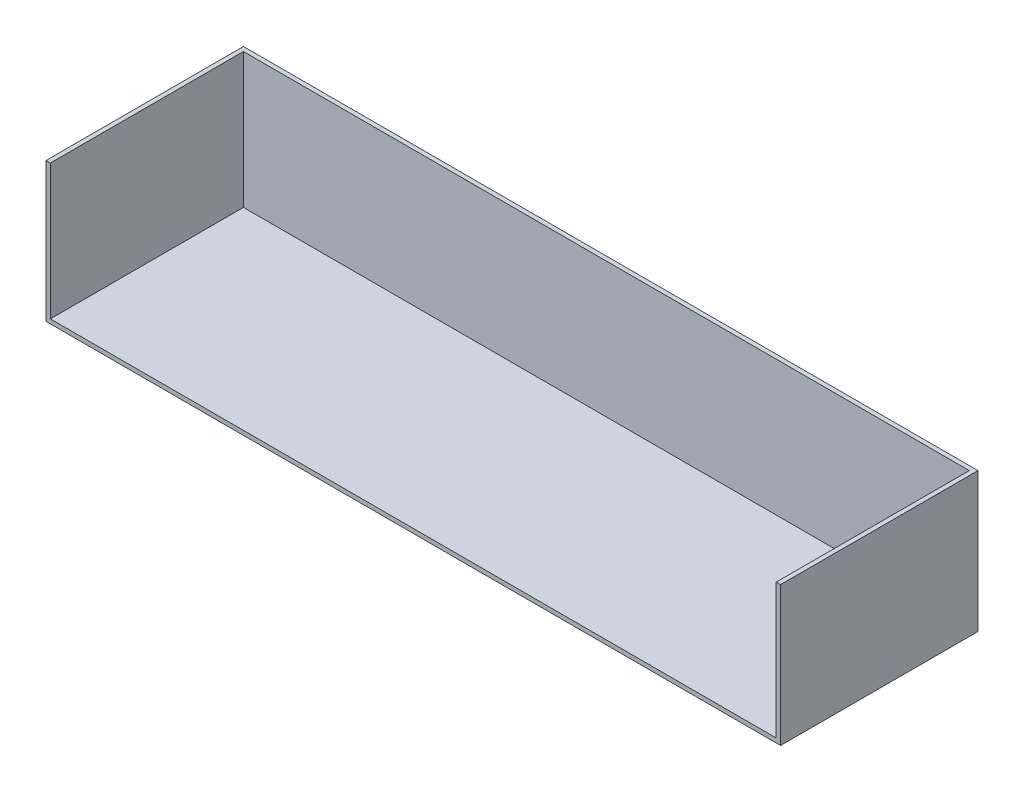
ISO-10303-21;
HEADER;
FILE_DESCRIPTION(('STEP AP214'),'2;1');
FILE_NAME('part.step','',(''),(''),'','','');
FILE_SCHEMA(('AUTOMOTIVE_DESIGN { 1 0 10303 214 1 1 1 1 }'));
ENDSEC;
DATA;
#1=APPLICATION_CONTEXT('core data for automotive mechanical design processes');
#2=APPLICATION_PROTOCOL_DEFINITION('international standard','automotive_design',2000,#1);
#3=PRODUCT_CONTEXT('',#1,'mechanical');
#4=PRODUCT('Part','Part','',(#3));
#5=PRODUCT_RELATED_PRODUCT_CATEGORY('part','',(#4));
#6=PRODUCT_DEFINITION_FORMATION('','',#4);
#7=PRODUCT_DEFINITION_CONTEXT('part definition',#1,'design');
#8=PRODUCT_DEFINITION('design','',#6,#7);
#9=PRODUCT_DEFINITION_SHAPE('','',#8);
#10=(LENGTH_UNIT() NAMED_UNIT(*) SI_UNIT(.MILLI.,.METRE.));
#11=(NAMED_UNIT(*) PLANE_ANGLE_UNIT() SI_UNIT($,.RADIAN.));
#12=(NAMED_UNIT(*) SI_UNIT($,.STERADIAN.) SOLID_ANGLE_UNIT());
#13=UNCERTAINTY_MEASURE_WITH_UNIT(LENGTH_MEASURE(1.E-05),#10,'distance_accuracy_value','');
#14=(GEOMETRIC_REPRESENTATION_CONTEXT(3) GLOBAL_UNCERTAINTY_ASSIGNED_CONTEXT((#13)) GLOBAL_UNIT_ASSIGNED_CONTEXT((#10,
#11,#12)) REPRESENTATION_CONTEXT('',''));
#15=CARTESIAN_POINT('',(0.,0.,0.));
#16=DIRECTION('',(0.,0.,1.));
#17=DIRECTION('',(1.,0.,0.));
#18=AXIS2_PLACEMENT_3D('',#15,#16,#17);
#19=CARTESIAN_POINT('',(0.,96.,0.));
#20=DIRECTION('',(0.,-1.,0.));
#21=DIRECTION('',(0.,0.,-1.));
#22=AXIS2_PLACEMENT_3D('',#19,#20,#21);
#23=PLANE('',#22);
#24=DIRECTION('',(0.,0.,-1.));
#25=VECTOR('',#24,1.);
#26=CARTESIAN_POINT('',(250.,96.,0.));
#27=LINE('',#26,#25);
#28=CARTESIAN_POINT('',(250.,96.,68.));
#29=VERTEX_POINT('',#28);
#30=CARTESIAN_POINT('',(250.,96.,-65.));
#31=VERTEX_POINT('',#30);
#32=EDGE_CURVE('E143',#29,#31,#27,.T.);
#33=ORIENTED_EDGE('',*,*,#32,.F.);
#34=DIRECTION('',(1.,0.,0.));
#35=VECTOR('',#34,1.);
#36=CARTESIAN_POINT('',(253.,96.,68.));
#37=LINE('',#36,#35);
#38=CARTESIAN_POINT('',(253.,96.,68.));
#39=VERTEX_POINT('',#38);
#40=EDGE_CURVE('E128',#29,#39,#37,.T.);
#41=ORIENTED_EDGE('',*,*,#40,.T.);
#42=DIRECTION('',(0.,0.,-1.));
#43=VECTOR('',#42,1.);
#44=CARTESIAN_POINT('',(253.,96.,-68.));
#45=LINE('',#44,#43);
#46=CARTESIAN_POINT('',(253.,96.,-68.));
#47=VERTEX_POINT('',#46);
#48=EDGE_CURVE('E149',#39,#47,#45,.T.);
#49=ORIENTED_EDGE('',*,*,#48,.T.);
#50=DIRECTION('',(-1.,0.,0.));
#51=VECTOR('',#50,1.);
#52=CARTESIAN_POINT('',(253.,96.,-68.));
#53=LINE('',#52,#51);
#54=CARTESIAN_POINT('',(-253.,96.,-68.));
#55=VERTEX_POINT('',#54);
#56=EDGE_CURVE('E59',#47,#55,#53,.T.);
#57=ORIENTED_EDGE('',*,*,#56,.T.);
#58=DIRECTION('',(0.,0.,1.));
#59=VECTOR('',#58,1.);
#60=CARTESIAN_POINT('',(-253.,96.,-68.));
#61=LINE('',#60,#59);
#62=CARTESIAN_POINT('',(-253.,96.,68.));
#63=VERTEX_POINT('',#62);
#64=EDGE_CURVE('E146',#55,#63,#61,.T.);
#65=ORIENTED_EDGE('',*,*,#64,.T.);
#66=CARTESIAN_POINT('',(-250.,96.,68.));
#67=VERTEX_POINT('',#66);
#68=EDGE_CURVE('E87',#63,#67,#37,.T.);
#69=ORIENTED_EDGE('',*,*,#68,.T.);
#70=DIRECTION('',(0.,0.,1.));
#71=VECTOR('',#70,1.);
#72=CARTESIAN_POINT('',(-250.,96.,0.));
#73=LINE('',#72,#71);
#74=CARTESIAN_POINT('',(-250.,96.,-65.));
#75=VERTEX_POINT('',#74);
#76=EDGE_CURVE('E141',#75,#67,#73,.T.);
#77=ORIENTED_EDGE('',*,*,#76,.F.);
#78=DIRECTION('',(-1.,0.,0.));
#79=VECTOR('',#78,1.);
#80=CARTESIAN_POINT('',(0.,96.,-65.));
#81=LINE('',#80,#79);
#82=EDGE_CURVE('E136',#31,#75,#81,.T.);
#83=ORIENTED_EDGE('',*,*,#82,.F.);
#84=EDGE_LOOP('',(#33,#41,#49,#57,#65,#69,#77,#83));
#85=FACE_BOUND('',#84,.T.);
#86=ADVANCED_FACE('F35',(#85),#23,.F.);
#87=CARTESIAN_POINT('',(-253.,96.,-68.));
#88=DIRECTION('',(1.,0.,0.));
#89=DIRECTION('',(0.,0.,-1.));
#90=AXIS2_PLACEMENT_3D('',#87,#88,#89);
#91=PLANE('',#90);
#92=DIRECTION('',(0.,0.,1.));
#93=VECTOR('',#92,1.);
#94=CARTESIAN_POINT('',(-253.,0.,-68.));
#95=LINE('',#94,#93);
#96=CARTESIAN_POINT('',(-253.,0.,-68.));
#97=VERTEX_POINT('',#96);
#98=CARTESIAN_POINT('',(-253.,0.,68.));
#99=VERTEX_POINT('',#98);
#100=EDGE_CURVE('E139',#97,#99,#95,.T.);
#101=ORIENTED_EDGE('',*,*,#100,.T.);
#102=DIRECTION('',(0.,-1.,0.));
#103=VECTOR('',#102,1.);
#104=CARTESIAN_POINT('',(-253.,96.,68.));
#105=LINE('',#104,#103);
#106=EDGE_CURVE('E11',#63,#99,#105,.T.);
#107=ORIENTED_EDGE('',*,*,#106,.F.);
#108=ORIENTED_EDGE('',*,*,#64,.F.);
#109=DIRECTION('',(0.,-1.,0.));
#110=VECTOR('',#109,1.);
#111=CARTESIAN_POINT('',(-253.,96.,-68.));
#112=LINE('',#111,#110);
#113=EDGE_CURVE('E152',#55,#97,#112,.T.);
#114=ORIENTED_EDGE('',*,*,#113,.T.);
#115=EDGE_LOOP('',(#101,#107,#108,#114));
#116=FACE_BOUND('',#115,.T.);
#117=ADVANCED_FACE('F37',(#116),#91,.F.);
#118=CARTESIAN_POINT('',(253.,96.,68.));
#119=DIRECTION('',(0.,0.,-1.));
#120=DIRECTION('',(-1.,0.,0.));
#121=AXIS2_PLACEMENT_3D('',#118,#119,#120);
#122=PLANE('',#121);
#123=ORIENTED_EDGE('',*,*,#40,.F.);
#124=DIRECTION('',(0.,1.,0.));
#125=VECTOR('',#124,1.);
#126=CARTESIAN_POINT('',(250.,-497.008999919001,68.));
#127=LINE('',#126,#125);
#128=CARTESIAN_POINT('',(250.,3.,68.));
#129=VERTEX_POINT('',#128);
#130=EDGE_CURVE('E114',#129,#29,#127,.T.);
#131=ORIENTED_EDGE('',*,*,#130,.F.);
#132=DIRECTION('',(1.,0.,0.));
#133=VECTOR('',#132,1.);
#134=CARTESIAN_POINT('',(-250.,3.,68.));
#135=LINE('',#134,#133);
#136=CARTESIAN_POINT('',(-250.,3.,68.));
#137=VERTEX_POINT('',#136);
#138=EDGE_CURVE('E121',#137,#129,#135,.T.);
#139=ORIENTED_EDGE('',*,*,#138,.F.);
#140=DIRECTION('',(0.,1.,0.));
#141=VECTOR('',#140,1.);
#142=CARTESIAN_POINT('',(-250.,-497.008999919001,68.));
#143=LINE('',#142,#141);
#144=EDGE_CURVE('E129',#137,#67,#143,.T.);
#145=ORIENTED_EDGE('',*,*,#144,.T.);
#146=ORIENTED_EDGE('',*,*,#68,.F.);
#147=ORIENTED_EDGE('',*,*,#106,.T.);
#148=DIRECTION('',(1.,0.,0.));
#149=VECTOR('',#148,1.);
#150=CARTESIAN_POINT('',(253.,0.,68.));
#151=LINE('',#150,#149);
#152=CARTESIAN_POINT('',(253.,0.,68.));
#153=VERTEX_POINT('',#152);
#154=EDGE_CURVE('E155',#99,#153,#151,.T.);
#155=ORIENTED_EDGE('',*,*,#154,.T.);
#156=DIRECTION('',(0.,-1.,0.));
#157=VECTOR('',#156,1.);
#158=CARTESIAN_POINT('',(253.,96.,68.));
#159=LINE('',#158,#157);
#160=EDGE_CURVE('E43',#39,#153,#159,.T.);
#161=ORIENTED_EDGE('',*,*,#160,.F.);
#162=EDGE_LOOP('',(#123,#131,#139,#145,#146,#147,#155,#161));
#163=FACE_BOUND('',#162,.T.);
#164=ADVANCED_FACE('F126',(#163),#122,.F.);
#165=CARTESIAN_POINT('',(253.,96.,-68.));
#166=DIRECTION('',(-1.,0.,0.));
#167=DIRECTION('',(0.,0.,1.));
#168=AXIS2_PLACEMENT_3D('',#165,#166,#167);
#169=PLANE('',#168);
#170=DIRECTION('',(0.,0.,-1.));
#171=VECTOR('',#170,1.);
#172=CARTESIAN_POINT('',(253.,0.,-68.));
#173=LINE('',#172,#171);
#174=CARTESIAN_POINT('',(253.,0.,-68.));
#175=VERTEX_POINT('',#174);
#176=EDGE_CURVE('E157',#153,#175,#173,.T.);
#177=ORIENTED_EDGE('',*,*,#176,.T.);
#178=DIRECTION('',(0.,-1.,0.));
#179=VECTOR('',#178,1.);
#180=CARTESIAN_POINT('',(253.,96.,-68.));
#181=LINE('',#180,#179);
#182=EDGE_CURVE('E161',#47,#175,#181,.T.);
#183=ORIENTED_EDGE('',*,*,#182,.F.);
#184=ORIENTED_EDGE('',*,*,#48,.F.);
#185=ORIENTED_EDGE('',*,*,#160,.T.);
#186=EDGE_LOOP('',(#177,#183,#184,#185));
#187=FACE_BOUND('',#186,.T.);
#188=ADVANCED_FACE('F166',(#187),#169,.F.);
#189=CARTESIAN_POINT('',(253.,96.,-68.));
#190=DIRECTION('',(0.,0.,1.));
#191=DIRECTION('',(1.,0.,0.));
#192=AXIS2_PLACEMENT_3D('',#189,#190,#191);
#193=PLANE('',#192);
#194=DIRECTION('',(-1.,0.,0.));
#195=VECTOR('',#194,1.);
#196=CARTESIAN_POINT('',(253.,0.,-68.));
#197=LINE('',#196,#195);
#198=EDGE_CURVE('E80',#175,#97,#197,.T.);
#199=ORIENTED_EDGE('',*,*,#198,.T.);
#200=ORIENTED_EDGE('',*,*,#113,.F.);
#201=ORIENTED_EDGE('',*,*,#56,.F.);
#202=ORIENTED_EDGE('',*,*,#182,.T.);
#203=EDGE_LOOP('',(#199,#200,#201,#202));
#204=FACE_BOUND('',#203,.T.);
#205=ADVANCED_FACE('F174',(#204),#193,.F.);
#206=CARTESIAN_POINT('',(0.,0.,0.));
#207=DIRECTION('',(0.,-1.,0.));
#208=DIRECTION('',(0.,0.,-1.));
#209=AXIS2_PLACEMENT_3D('',#206,#207,#208);
#210=PLANE('',#209);
#211=ORIENTED_EDGE('',*,*,#100,.F.);
#212=ORIENTED_EDGE('',*,*,#198,.F.);
#213=ORIENTED_EDGE('',*,*,#176,.F.);
#214=ORIENTED_EDGE('',*,*,#154,.F.);
#215=EDGE_LOOP('',(#211,#212,#213,#214));
#216=FACE_BOUND('',#215,.T.);
#217=ADVANCED_FACE('F170',(#216),#210,.T.);
#218=CARTESIAN_POINT('',(-250.,96.,-68.));
#219=DIRECTION('',(1.,0.,0.));
#220=DIRECTION('',(0.,0.,-1.));
#221=AXIS2_PLACEMENT_3D('',#218,#219,#220);
#222=PLANE('',#221);
#223=DIRECTION('',(0.,0.,1.));
#224=VECTOR('',#223,1.);
#225=CARTESIAN_POINT('',(-250.,3.,0.));
#226=LINE('',#225,#224);
#227=CARTESIAN_POINT('',(-250.,3.,-65.));
#228=VERTEX_POINT('',#227);
#229=EDGE_CURVE('E118',#228,#137,#226,.T.);
#230=ORIENTED_EDGE('',*,*,#229,.F.);
#231=DIRECTION('',(0.,-1.,0.));
#232=VECTOR('',#231,1.);
#233=CARTESIAN_POINT('',(-250.,96.,-65.));
#234=LINE('',#233,#232);
#235=EDGE_CURVE('E134',#75,#228,#234,.T.);
#236=ORIENTED_EDGE('',*,*,#235,.F.);
#237=ORIENTED_EDGE('',*,*,#76,.T.);
#238=ORIENTED_EDGE('',*,*,#144,.F.);
#239=EDGE_LOOP('',(#230,#236,#237,#238));
#240=FACE_BOUND('',#239,.T.);
#241=ADVANCED_FACE('F181',(#240),#222,.T.);
#242=CARTESIAN_POINT('',(250.,96.,-68.));
#243=DIRECTION('',(-1.,0.,0.));
#244=DIRECTION('',(0.,0.,1.));
#245=AXIS2_PLACEMENT_3D('',#242,#243,#244);
#246=PLANE('',#245);
#247=DIRECTION('',(0.,0.,-1.));
#248=VECTOR('',#247,1.);
#249=CARTESIAN_POINT('',(250.,3.,0.));
#250=LINE('',#249,#248);
#251=CARTESIAN_POINT('',(250.,3.,-65.));
#252=VERTEX_POINT('',#251);
#253=EDGE_CURVE('E110',#129,#252,#250,.T.);
#254=ORIENTED_EDGE('',*,*,#253,.F.);
#255=ORIENTED_EDGE('',*,*,#130,.T.);
#256=ORIENTED_EDGE('',*,*,#32,.T.);
#257=DIRECTION('',(0.,-1.,0.));
#258=VECTOR('',#257,1.);
#259=CARTESIAN_POINT('',(250.,96.,-65.));
#260=LINE('',#259,#258);
#261=EDGE_CURVE('E50',#31,#252,#260,.T.);
#262=ORIENTED_EDGE('',*,*,#261,.T.);
#263=EDGE_LOOP('',(#254,#255,#256,#262));
#264=FACE_BOUND('',#263,.T.);
#265=ADVANCED_FACE('F112',(#264),#246,.T.);
#266=CARTESIAN_POINT('',(253.,96.,-65.));
#267=DIRECTION('',(0.,0.,1.));
#268=DIRECTION('',(1.,0.,0.));
#269=AXIS2_PLACEMENT_3D('',#266,#267,#268);
#270=PLANE('',#269);
#271=DIRECTION('',(-1.,0.,0.));
#272=VECTOR('',#271,1.);
#273=CARTESIAN_POINT('',(0.,3.,-65.));
#274=LINE('',#273,#272);
#275=EDGE_CURVE('E117',#252,#228,#274,.T.);
#276=ORIENTED_EDGE('',*,*,#275,.F.);
#277=ORIENTED_EDGE('',*,*,#261,.F.);
#278=ORIENTED_EDGE('',*,*,#82,.T.);
#279=ORIENTED_EDGE('',*,*,#235,.T.);
#280=EDGE_LOOP('',(#276,#277,#278,#279));
#281=FACE_BOUND('',#280,.T.);
#282=ADVANCED_FACE('F192',(#281),#270,.T.);
#283=CARTESIAN_POINT('',(0.,3.,0.));
#284=DIRECTION('',(0.,-1.,0.));
#285=DIRECTION('',(0.,0.,-1.));
#286=AXIS2_PLACEMENT_3D('',#283,#284,#285);
#287=PLANE('',#286);
#288=ORIENTED_EDGE('',*,*,#229,.T.);
#289=ORIENTED_EDGE('',*,*,#138,.T.);
#290=ORIENTED_EDGE('',*,*,#253,.T.);
#291=ORIENTED_EDGE('',*,*,#275,.T.);
#292=EDGE_LOOP('',(#288,#289,#290,#291));
#293=FACE_BOUND('',#292,.T.);
#294=ADVANCED_FACE('F122',(#293),#287,.F.);
#295=CLOSED_SHELL('',(#86,#117,#164,#188,#205,#217,#241,#265,#282,#294));
#296=MANIFOLD_SOLID_BREP('B2',#295);
#297=ADVANCED_BREP_SHAPE_REPRESENTATION('',(#18,#296),#14);
#298=SHAPE_DEFINITION_REPRESENTATION(#9,#297);
ENDSEC;
END-ISO-10303-21;
